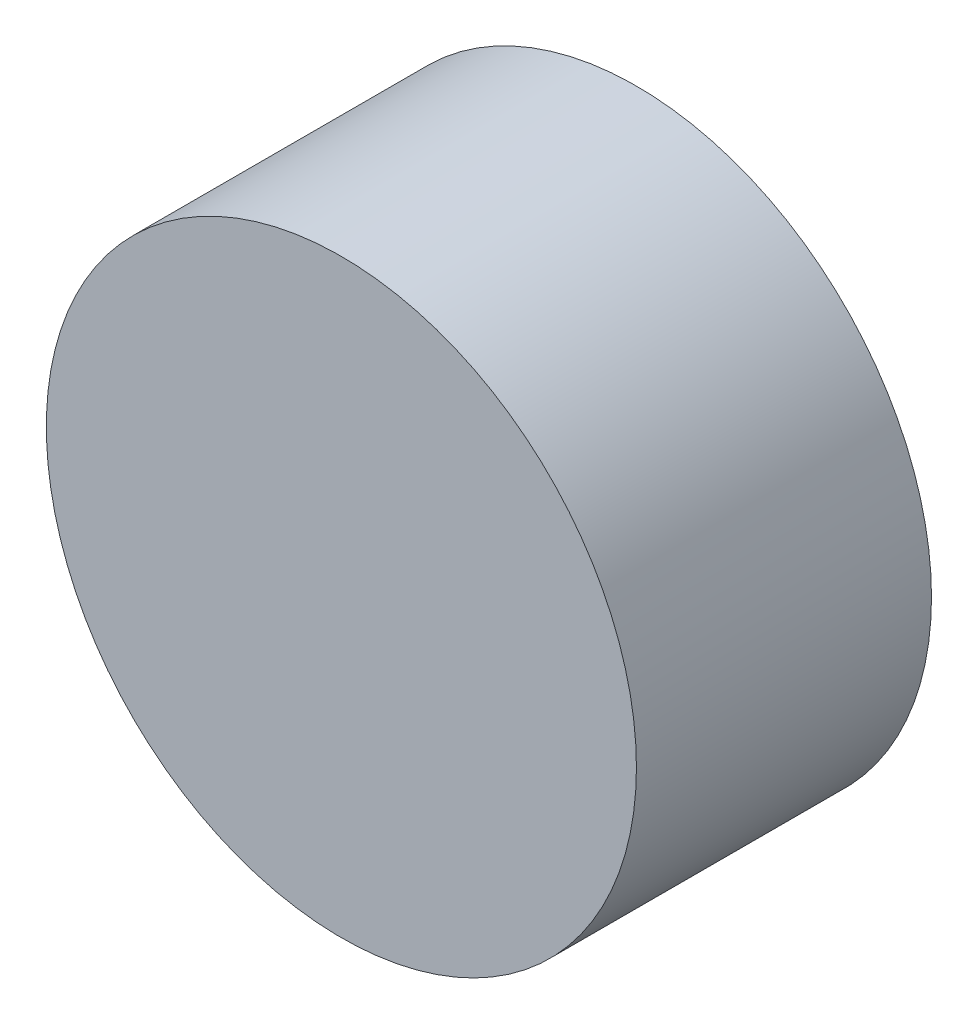
ISO-10303-21;
HEADER;
FILE_DESCRIPTION(('STEP AP214'),'2;1');
FILE_NAME('part.step','',(''),(''),'','','');
FILE_SCHEMA(('AUTOMOTIVE_DESIGN { 1 0 10303 214 1 1 1 1 }'));
ENDSEC;
DATA;
#1=APPLICATION_CONTEXT('core data for automotive mechanical design processes');
#2=APPLICATION_PROTOCOL_DEFINITION('international standard','automotive_design',2000,#1);
#3=PRODUCT_CONTEXT('',#1,'mechanical');
#4=PRODUCT('Part','Part','',(#3));
#5=PRODUCT_RELATED_PRODUCT_CATEGORY('part','',(#4));
#6=PRODUCT_DEFINITION_FORMATION('','',#4);
#7=PRODUCT_DEFINITION_CONTEXT('part definition',#1,'design');
#8=PRODUCT_DEFINITION('design','',#6,#7);
#9=PRODUCT_DEFINITION_SHAPE('','',#8);
#10=(LENGTH_UNIT() NAMED_UNIT(*) SI_UNIT(.MILLI.,.METRE.));
#11=(NAMED_UNIT(*) PLANE_ANGLE_UNIT() SI_UNIT($,.RADIAN.));
#12=(NAMED_UNIT(*) SI_UNIT($,.STERADIAN.) SOLID_ANGLE_UNIT());
#13=UNCERTAINTY_MEASURE_WITH_UNIT(LENGTH_MEASURE(1.E-05),#10,'distance_accuracy_value','');
#14=(GEOMETRIC_REPRESENTATION_CONTEXT(3) GLOBAL_UNCERTAINTY_ASSIGNED_CONTEXT((#13)) GLOBAL_UNIT_ASSIGNED_CONTEXT((#10,
#11,#12)) REPRESENTATION_CONTEXT('',''));
#15=CARTESIAN_POINT('',(0.,0.,0.));
#16=DIRECTION('',(0.,0.,1.));
#17=DIRECTION('',(1.,0.,0.));
#18=AXIS2_PLACEMENT_3D('',#15,#16,#17);
#19=CARTESIAN_POINT('',(7.,7.,7.));
#20=DIRECTION('',(0.,0.,-1.));
#21=DIRECTION('',(-1.,0.,0.));
#22=AXIS2_PLACEMENT_3D('',#19,#20,#21);
#23=CYLINDRICAL_SURFACE('',#22,7.);
#24=CARTESIAN_POINT('',(7.,7.,7.));
#25=DIRECTION('',(0.,0.,1.));
#26=DIRECTION('',(1.,0.,0.));
#27=AXIS2_PLACEMENT_3D('',#24,#25,#26);
#28=CIRCLE('',#27,7.);
#29=CARTESIAN_POINT('',(14.,7.,7.));
#30=VERTEX_POINT('',#29);
#31=EDGE_CURVE('E10',#30,#30,#28,.T.);
#32=ORIENTED_EDGE('',*,*,#31,.F.);
#33=EDGE_LOOP('',(#32));
#34=FACE_BOUND('',#33,.T.);
#35=CARTESIAN_POINT('',(7.,7.,0.));
#36=DIRECTION('',(0.,0.,1.));
#37=DIRECTION('',(1.,0.,0.));
#38=AXIS2_PLACEMENT_3D('',#35,#36,#37);
#39=CIRCLE('',#38,7.);
#40=CARTESIAN_POINT('',(14.,7.,0.));
#41=VERTEX_POINT('',#40);
#42=EDGE_CURVE('E37',#41,#41,#39,.T.);
#43=ORIENTED_EDGE('',*,*,#42,.T.);
#44=EDGE_LOOP('',(#43));
#45=FACE_BOUND('',#44,.T.);
#46=ADVANCED_FACE('F40',(#34,#45),#23,.T.);
#47=CARTESIAN_POINT('',(7.,7.,7.));
#48=DIRECTION('',(0.,0.,1.));
#49=DIRECTION('',(1.,0.,0.));
#50=AXIS2_PLACEMENT_3D('',#47,#48,#49);
#51=PLANE('',#50);
#52=ORIENTED_EDGE('',*,*,#31,.T.);
#53=EDGE_LOOP('',(#52));
#54=FACE_BOUND('',#53,.T.);
#55=ADVANCED_FACE('F55',(#54),#51,.T.);
#56=CARTESIAN_POINT('',(7.,7.,0.));
#57=DIRECTION('',(0.,0.,1.));
#58=DIRECTION('',(1.,0.,0.));
#59=AXIS2_PLACEMENT_3D('',#56,#57,#58);
#60=PLANE('',#59);
#61=ORIENTED_EDGE('',*,*,#42,.F.);
#62=EDGE_LOOP('',(#61));
#63=FACE_BOUND('',#62,.T.);
#64=ADVANCED_FACE('F49',(#63),#60,.F.);
#65=CLOSED_SHELL('',(#46,#55,#64));
#66=MANIFOLD_SOLID_BREP('B2',#65);
#67=ADVANCED_BREP_SHAPE_REPRESENTATION('',(#18,#66),#14);
#68=SHAPE_DEFINITION_REPRESENTATION(#9,#67);
ENDSEC;
END-ISO-10303-21;
